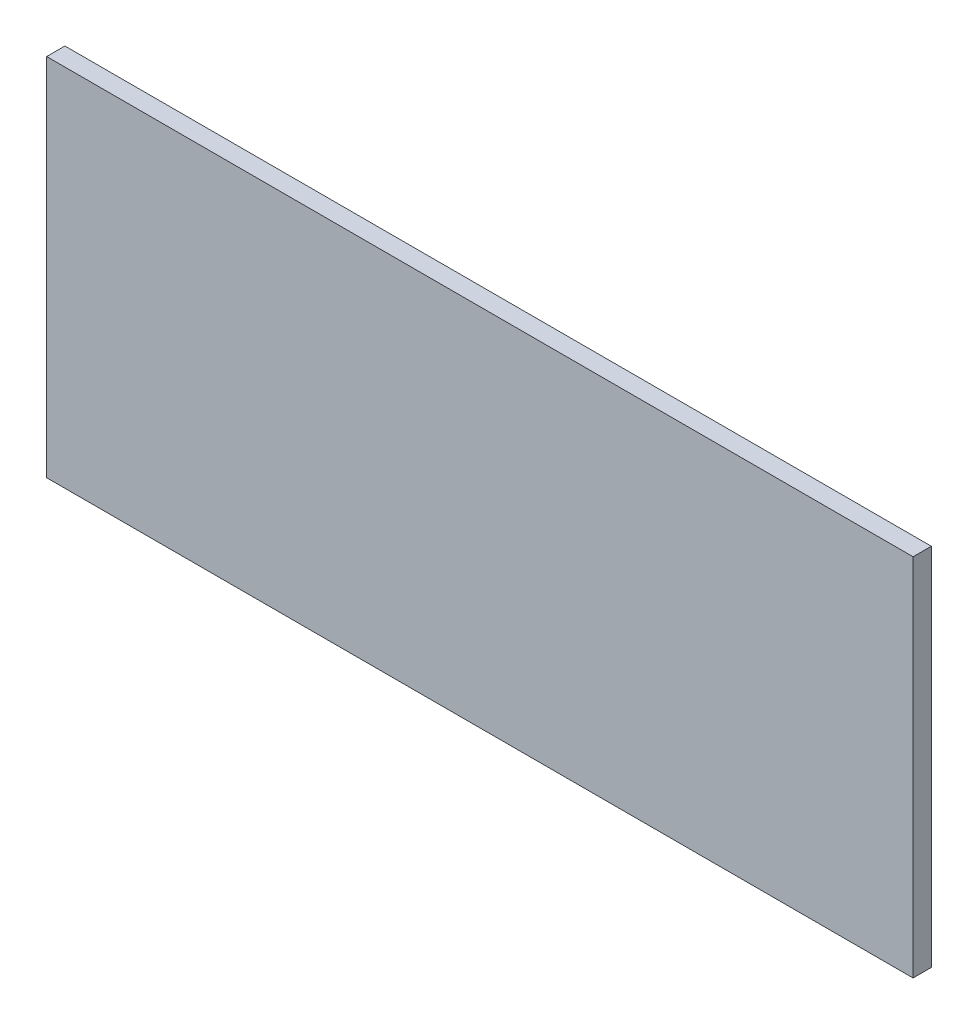
ISO-10303-21;
HEADER;
FILE_DESCRIPTION(('STEP AP214'),'2;1');
FILE_NAME('part.step','',(''),(''),'','','');
FILE_SCHEMA(('AUTOMOTIVE_DESIGN { 1 0 10303 214 1 1 1 1 }'));
ENDSEC;
DATA;
#1=APPLICATION_CONTEXT('core data for automotive mechanical design processes');
#2=APPLICATION_PROTOCOL_DEFINITION('international standard','automotive_design',2000,#1);
#3=PRODUCT_CONTEXT('',#1,'mechanical');
#4=PRODUCT('Part','Part','',(#3));
#5=PRODUCT_RELATED_PRODUCT_CATEGORY('part','',(#4));
#6=PRODUCT_DEFINITION_FORMATION('','',#4);
#7=PRODUCT_DEFINITION_CONTEXT('part definition',#1,'design');
#8=PRODUCT_DEFINITION('design','',#6,#7);
#9=PRODUCT_DEFINITION_SHAPE('','',#8);
#10=(LENGTH_UNIT() NAMED_UNIT(*) SI_UNIT(.MILLI.,.METRE.));
#11=(NAMED_UNIT(*) PLANE_ANGLE_UNIT() SI_UNIT($,.RADIAN.));
#12=(NAMED_UNIT(*) SI_UNIT($,.STERADIAN.) SOLID_ANGLE_UNIT());
#13=UNCERTAINTY_MEASURE_WITH_UNIT(LENGTH_MEASURE(1.E-05),#10,'distance_accuracy_value','');
#14=(GEOMETRIC_REPRESENTATION_CONTEXT(3) GLOBAL_UNCERTAINTY_ASSIGNED_CONTEXT((#13)) GLOBAL_UNIT_ASSIGNED_CONTEXT((#10,
#11,#12)) REPRESENTATION_CONTEXT('',''));
#15=CARTESIAN_POINT('',(0.,0.,0.));
#16=DIRECTION('',(0.,0.,1.));
#17=DIRECTION('',(1.,0.,0.));
#18=AXIS2_PLACEMENT_3D('',#15,#16,#17);
#19=CARTESIAN_POINT('',(-91.7627311549764,-11.7060935604785,4.));
#20=DIRECTION('',(1.,0.,0.));
#21=DIRECTION('',(0.,1.,0.));
#22=AXIS2_PLACEMENT_3D('',#19,#20,#21);
#23=PLANE('',#22);
#24=DIRECTION('',(0.,-1.,0.));
#25=VECTOR('',#24,1.);
#26=CARTESIAN_POINT('',(-91.7627311549764,-11.7060935604785,0.));
#27=LINE('',#26,#25);
#28=CARTESIAN_POINT('',(-91.7627311549764,-11.7060935604785,0.));
#29=VERTEX_POINT('',#28);
#30=CARTESIAN_POINT('',(-91.7627311549764,-91.7060935604785,0.));
#31=VERTEX_POINT('',#30);
#32=EDGE_CURVE('E96',#29,#31,#27,.T.);
#33=ORIENTED_EDGE('',*,*,#32,.T.);
#34=DIRECTION('',(0.,0.,-1.));
#35=VECTOR('',#34,1.);
#36=CARTESIAN_POINT('',(-91.7627311549764,-91.7060935604785,4.));
#37=LINE('',#36,#35);
#38=CARTESIAN_POINT('',(-91.7627311549764,-91.7060935604785,4.));
#39=VERTEX_POINT('',#38);
#40=EDGE_CURVE('E11',#39,#31,#37,.T.);
#41=ORIENTED_EDGE('',*,*,#40,.F.);
#42=DIRECTION('',(0.,-1.,0.));
#43=VECTOR('',#42,1.);
#44=CARTESIAN_POINT('',(-91.7627311549764,-11.7060935604785,4.));
#45=LINE('',#44,#43);
#46=CARTESIAN_POINT('',(-91.7627311549764,-11.7060935604785,4.));
#47=VERTEX_POINT('',#46);
#48=EDGE_CURVE('E84',#47,#39,#45,.T.);
#49=ORIENTED_EDGE('',*,*,#48,.F.);
#50=DIRECTION('',(0.,0.,-1.));
#51=VECTOR('',#50,1.);
#52=CARTESIAN_POINT('',(-91.7627311549764,-11.7060935604785,4.));
#53=LINE('',#52,#51);
#54=EDGE_CURVE('E92',#47,#29,#53,.T.);
#55=ORIENTED_EDGE('',*,*,#54,.T.);
#56=EDGE_LOOP('',(#33,#41,#49,#55));
#57=FACE_BOUND('',#56,.T.);
#58=ADVANCED_FACE('F33',(#57),#23,.F.);
#59=CARTESIAN_POINT('',(-91.7627311549764,-91.7060935604785,4.));
#60=DIRECTION('',(0.,1.,0.));
#61=DIRECTION('',(0.,0.,1.));
#62=AXIS2_PLACEMENT_3D('',#59,#60,#61);
#63=PLANE('',#62);
#64=DIRECTION('',(1.,0.,0.));
#65=VECTOR('',#64,1.);
#66=CARTESIAN_POINT('',(-91.7627311549764,-91.7060935604785,0.));
#67=LINE('',#66,#65);
#68=CARTESIAN_POINT('',(98.2372688450233,-91.7060935604785,0.));
#69=VERTEX_POINT('',#68);
#70=EDGE_CURVE('E88',#31,#69,#67,.T.);
#71=ORIENTED_EDGE('',*,*,#70,.T.);
#72=DIRECTION('',(0.,0.,-1.));
#73=VECTOR('',#72,1.);
#74=CARTESIAN_POINT('',(98.2372688450233,-91.7060935604785,4.));
#75=LINE('',#74,#73);
#76=CARTESIAN_POINT('',(98.2372688450233,-91.7060935604785,4.));
#77=VERTEX_POINT('',#76);
#78=EDGE_CURVE('E41',#77,#69,#75,.T.);
#79=ORIENTED_EDGE('',*,*,#78,.F.);
#80=DIRECTION('',(1.,0.,0.));
#81=VECTOR('',#80,1.);
#82=CARTESIAN_POINT('',(-91.7627311549764,-91.7060935604785,4.));
#83=LINE('',#82,#81);
#84=EDGE_CURVE('E79',#39,#77,#83,.T.);
#85=ORIENTED_EDGE('',*,*,#84,.F.);
#86=ORIENTED_EDGE('',*,*,#40,.T.);
#87=EDGE_LOOP('',(#71,#79,#85,#86));
#88=FACE_BOUND('',#87,.T.);
#89=ADVANCED_FACE('F87',(#88),#63,.F.);
#90=CARTESIAN_POINT('',(98.2372688450233,-11.7060935604785,4.));
#91=DIRECTION('',(-1.,0.,0.));
#92=DIRECTION('',(0.,0.,1.));
#93=AXIS2_PLACEMENT_3D('',#90,#91,#92);
#94=PLANE('',#93);
#95=DIRECTION('',(0.,1.,0.));
#96=VECTOR('',#95,1.);
#97=CARTESIAN_POINT('',(98.2372688450233,-11.7060935604785,0.));
#98=LINE('',#97,#96);
#99=CARTESIAN_POINT('',(98.2372688450233,-11.7060935604785,0.));
#100=VERTEX_POINT('',#99);
#101=EDGE_CURVE('E66',#69,#100,#98,.T.);
#102=ORIENTED_EDGE('',*,*,#101,.T.);
#103=DIRECTION('',(0.,0.,-1.));
#104=VECTOR('',#103,1.);
#105=CARTESIAN_POINT('',(98.2372688450233,-11.7060935604785,4.));
#106=LINE('',#105,#104);
#107=CARTESIAN_POINT('',(98.2372688450233,-11.7060935604785,4.));
#108=VERTEX_POINT('',#107);
#109=EDGE_CURVE('E89',#108,#100,#106,.T.);
#110=ORIENTED_EDGE('',*,*,#109,.F.);
#111=DIRECTION('',(0.,1.,0.));
#112=VECTOR('',#111,1.);
#113=CARTESIAN_POINT('',(98.2372688450233,-11.7060935604785,4.));
#114=LINE('',#113,#112);
#115=EDGE_CURVE('E82',#77,#108,#114,.T.);
#116=ORIENTED_EDGE('',*,*,#115,.F.);
#117=ORIENTED_EDGE('',*,*,#78,.T.);
#118=EDGE_LOOP('',(#102,#110,#116,#117));
#119=FACE_BOUND('',#118,.T.);
#120=ADVANCED_FACE('F90',(#119),#94,.F.);
#121=CARTESIAN_POINT('',(-91.7627311549764,-11.7060935604785,4.));
#122=DIRECTION('',(0.,-1.,0.));
#123=DIRECTION('',(0.,0.,-1.));
#124=AXIS2_PLACEMENT_3D('',#121,#122,#123);
#125=PLANE('',#124);
#126=DIRECTION('',(-1.,0.,0.));
#127=VECTOR('',#126,1.);
#128=CARTESIAN_POINT('',(-91.7627311549764,-11.7060935604785,0.));
#129=LINE('',#128,#127);
#130=EDGE_CURVE('E72',#100,#29,#129,.T.);
#131=ORIENTED_EDGE('',*,*,#130,.T.);
#132=ORIENTED_EDGE('',*,*,#54,.F.);
#133=DIRECTION('',(-1.,0.,0.));
#134=VECTOR('',#133,1.);
#135=CARTESIAN_POINT('',(-91.7627311549764,-11.7060935604785,4.));
#136=LINE('',#135,#134);
#137=EDGE_CURVE('E49',#108,#47,#136,.T.);
#138=ORIENTED_EDGE('',*,*,#137,.F.);
#139=ORIENTED_EDGE('',*,*,#109,.T.);
#140=EDGE_LOOP('',(#131,#132,#138,#139));
#141=FACE_BOUND('',#140,.T.);
#142=ADVANCED_FACE('F103',(#141),#125,.F.);
#143=CARTESIAN_POINT('',(0.,0.,4.));
#144=DIRECTION('',(0.,0.,1.));
#145=DIRECTION('',(1.,0.,0.));
#146=AXIS2_PLACEMENT_3D('',#143,#144,#145);
#147=PLANE('',#146);
#148=ORIENTED_EDGE('',*,*,#48,.T.);
#149=ORIENTED_EDGE('',*,*,#84,.T.);
#150=ORIENTED_EDGE('',*,*,#115,.T.);
#151=ORIENTED_EDGE('',*,*,#137,.T.);
#152=EDGE_LOOP('',(#148,#149,#150,#151));
#153=FACE_BOUND('',#152,.T.);
#154=ADVANCED_FACE('F80',(#153),#147,.T.);
#155=CARTESIAN_POINT('',(0.,0.,0.));
#156=DIRECTION('',(0.,0.,1.));
#157=DIRECTION('',(1.,0.,0.));
#158=AXIS2_PLACEMENT_3D('',#155,#156,#157);
#159=PLANE('',#158);
#160=ORIENTED_EDGE('',*,*,#32,.F.);
#161=ORIENTED_EDGE('',*,*,#130,.F.);
#162=ORIENTED_EDGE('',*,*,#101,.F.);
#163=ORIENTED_EDGE('',*,*,#70,.F.);
#164=EDGE_LOOP('',(#160,#161,#162,#163));
#165=FACE_BOUND('',#164,.T.);
#166=ADVANCED_FACE('F106',(#165),#159,.F.);
#167=CLOSED_SHELL('',(#58,#89,#120,#142,#154,#166));
#168=MANIFOLD_SOLID_BREP('B2',#167);
#169=ADVANCED_BREP_SHAPE_REPRESENTATION('',(#18,#168),#14);
#170=SHAPE_DEFINITION_REPRESENTATION(#9,#169);
ENDSEC;
END-ISO-10303-21;
